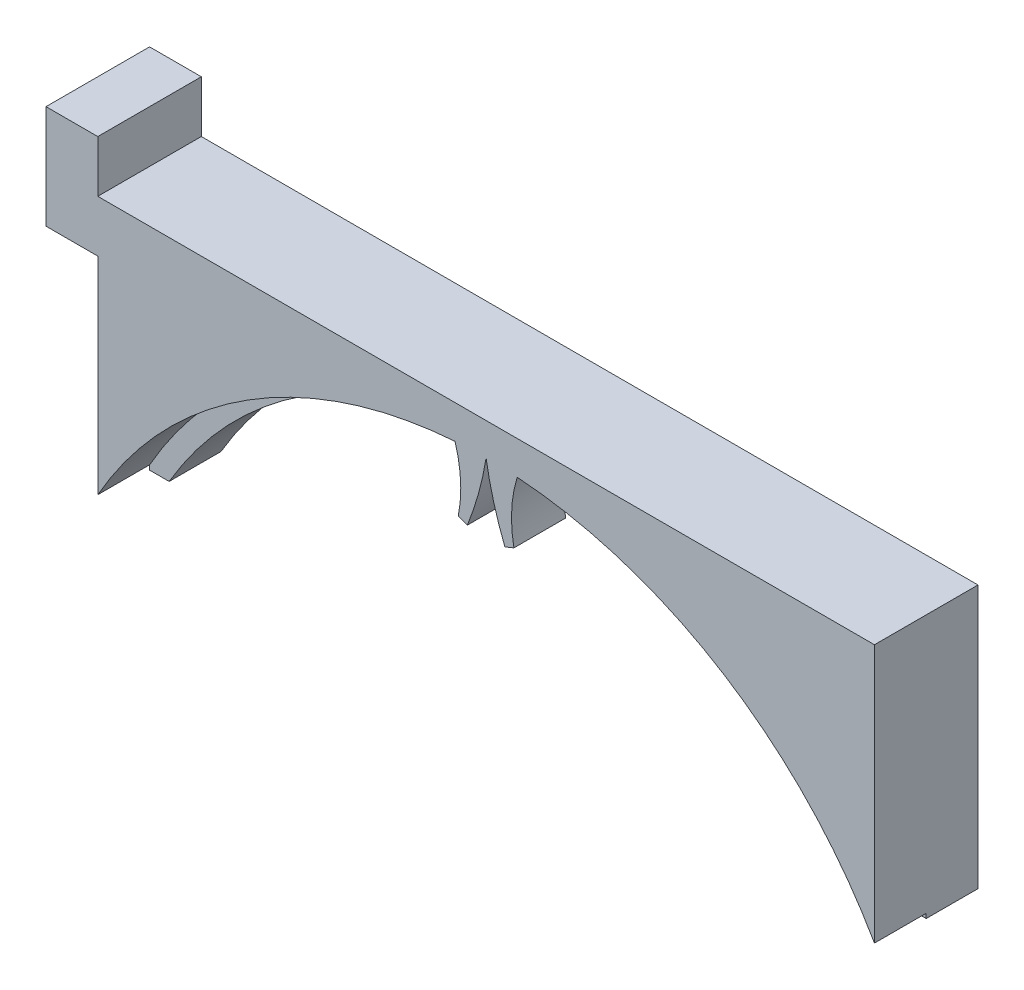
ISO-10303-21;
HEADER;
FILE_DESCRIPTION(('STEP AP214'),'2;1');
FILE_NAME('part.step','',(''),(''),'','','');
FILE_SCHEMA(('AUTOMOTIVE_DESIGN { 1 0 10303 214 1 1 1 1 }'));
ENDSEC;
DATA;
#1=APPLICATION_CONTEXT('core data for automotive mechanical design processes');
#2=APPLICATION_PROTOCOL_DEFINITION('international standard','automotive_design',2000,#1);
#3=PRODUCT_CONTEXT('',#1,'mechanical');
#4=PRODUCT('Part','Part','',(#3));
#5=PRODUCT_RELATED_PRODUCT_CATEGORY('part','',(#4));
#6=PRODUCT_DEFINITION_FORMATION('','',#4);
#7=PRODUCT_DEFINITION_CONTEXT('part definition',#1,'design');
#8=PRODUCT_DEFINITION('design','',#6,#7);
#9=PRODUCT_DEFINITION_SHAPE('','',#8);
#10=(LENGTH_UNIT() NAMED_UNIT(*) SI_UNIT(.MILLI.,.METRE.));
#11=(NAMED_UNIT(*) PLANE_ANGLE_UNIT() SI_UNIT($,.RADIAN.));
#12=(NAMED_UNIT(*) SI_UNIT($,.STERADIAN.) SOLID_ANGLE_UNIT());
#13=UNCERTAINTY_MEASURE_WITH_UNIT(LENGTH_MEASURE(1.E-05),#10,'distance_accuracy_value','');
#14=(GEOMETRIC_REPRESENTATION_CONTEXT(3) GLOBAL_UNCERTAINTY_ASSIGNED_CONTEXT((#13)) GLOBAL_UNIT_ASSIGNED_CONTEXT((#10,
#11,#12)) REPRESENTATION_CONTEXT('',''));
#15=CARTESIAN_POINT('',(0.,0.,0.));
#16=DIRECTION('',(0.,0.,1.));
#17=DIRECTION('',(1.,0.,0.));
#18=AXIS2_PLACEMENT_3D('',#15,#16,#17);
#19=CARTESIAN_POINT('',(-75.,0.,10.));
#20=DIRECTION('',(1.,0.,0.));
#21=DIRECTION('',(0.,0.,-1.));
#22=AXIS2_PLACEMENT_3D('',#19,#20,#21);
#23=PLANE('',#22);
#24=DIRECTION('',(0.,0.,1.));
#25=VECTOR('',#24,1.);
#26=CARTESIAN_POINT('',(-75.,-10.,0.));
#27=LINE('',#26,#25);
#28=CARTESIAN_POINT('',(-75.,-10.,0.));
#29=VERTEX_POINT('',#28);
#30=CARTESIAN_POINT('',(-75.,-10.,20.));
#31=VERTEX_POINT('',#30);
#32=EDGE_CURVE('E50',#29,#31,#27,.T.);
#33=ORIENTED_EDGE('',*,*,#32,.F.);
#34=DIRECTION('',(0.,-1.,0.));
#35=VECTOR('',#34,1.);
#36=CARTESIAN_POINT('',(-75.,0.,0.));
#37=LINE('',#36,#35);
#38=CARTESIAN_POINT('',(-75.,-50.8,0.));
#39=VERTEX_POINT('',#38);
#40=EDGE_CURVE('E197',#29,#39,#37,.T.);
#41=ORIENTED_EDGE('',*,*,#40,.T.);
#42=DIRECTION('',(0.,0.,-1.));
#43=VECTOR('',#42,1.);
#44=CARTESIAN_POINT('',(-75.,-50.8,10.));
#45=LINE('',#44,#43);
#46=CARTESIAN_POINT('',(-75.,-50.8,10.));
#47=VERTEX_POINT('',#46);
#48=EDGE_CURVE('E36',#47,#39,#45,.T.);
#49=ORIENTED_EDGE('',*,*,#48,.F.);
#50=DIRECTION('',(0.,-1.,0.));
#51=VECTOR('',#50,1.);
#52=CARTESIAN_POINT('',(-75.,0.,10.));
#53=LINE('',#52,#51);
#54=CARTESIAN_POINT('',(-75.,-49.9130466946871,10.));
#55=VERTEX_POINT('',#54);
#56=EDGE_CURVE('E291',#55,#47,#53,.T.);
#57=ORIENTED_EDGE('',*,*,#56,.F.);
#58=DIRECTION('',(0.,0.,-1.));
#59=VECTOR('',#58,1.);
#60=CARTESIAN_POINT('',(-75.,-49.9130466946871,20.));
#61=LINE('',#60,#59);
#62=CARTESIAN_POINT('',(-75.,-49.9130466946871,20.));
#63=VERTEX_POINT('',#62);
#64=EDGE_CURVE('E276',#63,#55,#61,.T.);
#65=ORIENTED_EDGE('',*,*,#64,.F.);
#66=DIRECTION('',(0.,-1.,0.));
#67=VECTOR('',#66,1.);
#68=CARTESIAN_POINT('',(-75.,0.,20.));
#69=LINE('',#68,#67);
#70=EDGE_CURVE('E235',#31,#63,#69,.T.);
#71=ORIENTED_EDGE('',*,*,#70,.F.);
#72=EDGE_LOOP('',(#33,#41,#49,#57,#65,#71));
#73=FACE_BOUND('',#72,.T.);
#74=ADVANCED_FACE('F33',(#73),#23,.F.);
#75=CARTESIAN_POINT('',(0.,-92.55,10.));
#76=DIRECTION('',(0.,0.,1.));
#77=DIRECTION('',(1.,0.,0.));
#78=AXIS2_PLACEMENT_3D('',#75,#76,#77);
#79=PLANE('',#78);
#80=CARTESIAN_POINT('',(61.4291765688217,3.78478174448975,10.));
#81=DIRECTION('',(0.,0.,1.));
#82=DIRECTION('',(1.,0.,0.));
#83=AXIS2_PLACEMENT_3D('',#80,#81,#82);
#84=CIRCLE('',#83,62.2478695870906);
#85=CARTESIAN_POINT('',(0.,-6.27769976893262,10.));
#86=VERTEX_POINT('',#85);
#87=CARTESIAN_POINT('',(0.727540184914201,-10.0032060872178,10.));
#88=VERTEX_POINT('',#87);
#89=EDGE_CURVE('E58',#86,#88,#84,.T.);
#90=ORIENTED_EDGE('',*,*,#89,.F.);
#91=CARTESIAN_POINT('',(-61.4291765688217,3.78478174448973,10.));
#92=DIRECTION('',(0.,0.,1.));
#93=DIRECTION('',(-1.,0.,0.));
#94=AXIS2_PLACEMENT_3D('',#91,#92,#93);
#95=CIRCLE('',#94,62.2478695870906);
#96=CARTESIAN_POINT('',(-0.727540184914173,-10.0032060872178,10.));
#97=VERTEX_POINT('',#96);
#98=EDGE_CURVE('E11',#97,#86,#95,.T.);
#99=ORIENTED_EDGE('',*,*,#98,.F.);
#100=CARTESIAN_POINT('',(0.,-92.55,10.));
#101=DIRECTION('',(0.,0.,-1.));
#102=DIRECTION('',(1.,0.,0.));
#103=AXIS2_PLACEMENT_3D('',#100,#101,#102);
#104=CIRCLE('',#103,82.55);
#105=EDGE_CURVE('E361',#97,#88,#104,.T.);
#106=ORIENTED_EDGE('',*,*,#105,.T.);
#107=EDGE_LOOP('',(#90,#99,#106));
#108=FACE_BOUND('',#107,.T.);
#109=ADVANCED_FACE('F419',(#108),#79,.T.);
#110=CARTESIAN_POINT('',(-29.6489004395039,-13.8015963330488,10.));
#111=DIRECTION('',(0.,0.,-1.));
#112=DIRECTION('',(-1.,0.,0.));
#113=AXIS2_PLACEMENT_3D('',#110,#111,#112);
#114=CIRCLE('',#113,24.7543884107778);
#115=CARTESIAN_POINT('',(-6.,-6.48659437856629,10.));
#116=VERTEX_POINT('',#115);
#117=CARTESIAN_POINT('',(-5.16358745807501,-10.1616521311247,10.));
#118=VERTEX_POINT('',#117);
#119=EDGE_CURVE('E259',#116,#118,#114,.T.);
#120=ORIENTED_EDGE('',*,*,#119,.F.);
#121=CARTESIAN_POINT('',(0.,-92.55,10.));
#122=DIRECTION('',(0.,0.,-1.));
#123=DIRECTION('',(1.,0.,0.));
#124=AXIS2_PLACEMENT_3D('',#121,#122,#123);
#125=CIRCLE('',#124,86.2723002310674);
#126=EDGE_CURVE('E255',#55,#116,#125,.T.);
#127=ORIENTED_EDGE('',*,*,#126,.F.);
#128=ORIENTED_EDGE('',*,*,#56,.T.);
#129=DIRECTION('',(1.,0.,0.));
#130=VECTOR('',#129,1.);
#131=CARTESIAN_POINT('',(-75.,-50.8,10.));
#132=LINE('',#131,#130);
#133=CARTESIAN_POINT('',(-71.2140435588375,-50.8,10.));
#134=VERTEX_POINT('',#133);
#135=EDGE_CURVE('E293',#47,#134,#132,.T.);
#136=ORIENTED_EDGE('',*,*,#135,.T.);
#137=EDGE_CURVE('E297',#134,#118,#104,.T.);
#138=ORIENTED_EDGE('',*,*,#137,.T.);
#139=EDGE_LOOP('',(#120,#127,#128,#136,#138));
#140=FACE_BOUND('',#139,.T.);
#141=ADVANCED_FACE('F423',(#140),#79,.T.);
#142=CARTESIAN_POINT('',(0.,-92.55,10.));
#143=DIRECTION('',(0.,0.,-1.));
#144=DIRECTION('',(1.,0.,0.));
#145=AXIS2_PLACEMENT_3D('',#142,#143,#144);
#146=CIRCLE('',#145,86.2723002310674);
#147=CARTESIAN_POINT('',(6.00000000000001,-6.48659437856627,10.));
#148=VERTEX_POINT('',#147);
#149=CARTESIAN_POINT('',(75.,-49.9130466946871,10.));
#150=VERTEX_POINT('',#149);
#151=EDGE_CURVE('E252',#148,#150,#146,.T.);
#152=ORIENTED_EDGE('',*,*,#151,.F.);
#153=CARTESIAN_POINT('',(29.6489004395039,-13.8015963330488,10.));
#154=DIRECTION('',(0.,0.,-1.));
#155=DIRECTION('',(-1.,0.,0.));
#156=AXIS2_PLACEMENT_3D('',#153,#154,#155);
#157=CIRCLE('',#156,24.7543884107778);
#158=CARTESIAN_POINT('',(5.16358745807501,-10.1616521311247,10.));
#159=VERTEX_POINT('',#158);
#160=EDGE_CURVE('E41',#159,#148,#157,.T.);
#161=ORIENTED_EDGE('',*,*,#160,.F.);
#162=CARTESIAN_POINT('',(71.2140435588375,-50.8,10.));
#163=VERTEX_POINT('',#162);
#164=EDGE_CURVE('E296',#159,#163,#104,.T.);
#165=ORIENTED_EDGE('',*,*,#164,.T.);
#166=DIRECTION('',(1.,0.,0.));
#167=VECTOR('',#166,1.);
#168=CARTESIAN_POINT('',(71.2140435588375,-50.8,10.));
#169=LINE('',#168,#167);
#170=CARTESIAN_POINT('',(75.,-50.8,10.));
#171=VERTEX_POINT('',#170);
#172=EDGE_CURVE('E300',#163,#171,#169,.T.);
#173=ORIENTED_EDGE('',*,*,#172,.T.);
#174=DIRECTION('',(0.,1.,0.));
#175=VECTOR('',#174,1.);
#176=CARTESIAN_POINT('',(75.,0.,10.));
#177=LINE('',#176,#175);
#178=EDGE_CURVE('E303',#171,#150,#177,.T.);
#179=ORIENTED_EDGE('',*,*,#178,.T.);
#180=EDGE_LOOP('',(#152,#161,#165,#173,#179));
#181=FACE_BOUND('',#180,.T.);
#182=ADVANCED_FACE('F363',(#181),#79,.T.);
#183=CARTESIAN_POINT('',(-75.,-50.8,10.));
#184=DIRECTION('',(0.,1.,0.));
#185=DIRECTION('',(0.,0.,1.));
#186=AXIS2_PLACEMENT_3D('',#183,#184,#185);
#187=PLANE('',#186);
#188=DIRECTION('',(1.,0.,0.));
#189=VECTOR('',#188,1.);
#190=CARTESIAN_POINT('',(-75.,-50.8,0.));
#191=LINE('',#190,#189);
#192=CARTESIAN_POINT('',(-71.2140435588375,-50.8,0.));
#193=VERTEX_POINT('',#192);
#194=EDGE_CURVE('E307',#39,#193,#191,.T.);
#195=ORIENTED_EDGE('',*,*,#194,.T.);
#196=DIRECTION('',(0.,0.,-1.));
#197=VECTOR('',#196,1.);
#198=CARTESIAN_POINT('',(-71.2140435588375,-50.8,10.));
#199=LINE('',#198,#197);
#200=EDGE_CURVE('E326',#134,#193,#199,.T.);
#201=ORIENTED_EDGE('',*,*,#200,.F.);
#202=ORIENTED_EDGE('',*,*,#135,.F.);
#203=ORIENTED_EDGE('',*,*,#48,.T.);
#204=EDGE_LOOP('',(#195,#201,#202,#203));
#205=FACE_BOUND('',#204,.T.);
#206=ADVANCED_FACE('F431',(#205),#187,.F.);
#207=CARTESIAN_POINT('',(0.,-92.55,10.));
#208=DIRECTION('',(0.,0.,-1.));
#209=DIRECTION('',(-1.,0.,0.));
#210=AXIS2_PLACEMENT_3D('',#207,#208,#209);
#211=CYLINDRICAL_SURFACE('',#210,82.55);
#212=CARTESIAN_POINT('',(0.,-92.55,0.));
#213=DIRECTION('',(0.,0.,-1.));
#214=DIRECTION('',(1.,0.,0.));
#215=AXIS2_PLACEMENT_3D('',#212,#213,#214);
#216=CIRCLE('',#215,82.55);
#217=CARTESIAN_POINT('',(71.2140435588375,-50.8,0.));
#218=VERTEX_POINT('',#217);
#219=EDGE_CURVE('E309',#193,#218,#216,.T.);
#220=ORIENTED_EDGE('',*,*,#219,.T.);
#221=DIRECTION('',(0.,0.,-1.));
#222=VECTOR('',#221,1.);
#223=CARTESIAN_POINT('',(71.2140435588375,-50.8,10.));
#224=LINE('',#223,#222);
#225=EDGE_CURVE('E324',#163,#218,#224,.T.);
#226=ORIENTED_EDGE('',*,*,#225,.F.);
#227=ORIENTED_EDGE('',*,*,#164,.F.);
#228=EDGE_CURVE('E359',#88,#159,#104,.T.);
#229=ORIENTED_EDGE('',*,*,#228,.F.);
#230=ORIENTED_EDGE('',*,*,#105,.F.);
#231=EDGE_CURVE('E301',#118,#97,#104,.T.);
#232=ORIENTED_EDGE('',*,*,#231,.F.);
#233=ORIENTED_EDGE('',*,*,#137,.F.);
#234=ORIENTED_EDGE('',*,*,#200,.T.);
#235=EDGE_LOOP('',(#220,#226,#227,#229,#230,#232,#233,#234));
#236=FACE_BOUND('',#235,.T.);
#237=ADVANCED_FACE('F366',(#236),#211,.F.);
#238=CARTESIAN_POINT('',(71.2140435588375,-50.8,10.));
#239=DIRECTION('',(0.,1.,0.));
#240=DIRECTION('',(0.,0.,1.));
#241=AXIS2_PLACEMENT_3D('',#238,#239,#240);
#242=PLANE('',#241);
#243=DIRECTION('',(1.,0.,0.));
#244=VECTOR('',#243,1.);
#245=CARTESIAN_POINT('',(71.2140435588375,-50.8,0.));
#246=LINE('',#245,#244);
#247=CARTESIAN_POINT('',(75.,-50.8,0.));
#248=VERTEX_POINT('',#247);
#249=EDGE_CURVE('E311',#218,#248,#246,.T.);
#250=ORIENTED_EDGE('',*,*,#249,.T.);
#251=DIRECTION('',(0.,0.,-1.));
#252=VECTOR('',#251,1.);
#253=CARTESIAN_POINT('',(75.,-50.8,10.));
#254=LINE('',#253,#252);
#255=EDGE_CURVE('E321',#171,#248,#254,.T.);
#256=ORIENTED_EDGE('',*,*,#255,.F.);
#257=ORIENTED_EDGE('',*,*,#172,.F.);
#258=ORIENTED_EDGE('',*,*,#225,.T.);
#259=EDGE_LOOP('',(#250,#256,#257,#258));
#260=FACE_BOUND('',#259,.T.);
#261=ADVANCED_FACE('F369',(#260),#242,.F.);
#262=CARTESIAN_POINT('',(75.,0.,10.));
#263=DIRECTION('',(-1.,0.,0.));
#264=DIRECTION('',(0.,0.,1.));
#265=AXIS2_PLACEMENT_3D('',#262,#263,#264);
#266=PLANE('',#265);
#267=DIRECTION('',(0.,1.,0.));
#268=VECTOR('',#267,1.);
#269=CARTESIAN_POINT('',(75.,0.,0.));
#270=LINE('',#269,#268);
#271=CARTESIAN_POINT('',(75.,0.,0.));
#272=VERTEX_POINT('',#271);
#273=EDGE_CURVE('E313',#248,#272,#270,.T.);
#274=ORIENTED_EDGE('',*,*,#273,.T.);
#275=DIRECTION('',(0.,0.,-1.));
#276=VECTOR('',#275,1.);
#277=CARTESIAN_POINT('',(75.,0.,10.));
#278=LINE('',#277,#276);
#279=CARTESIAN_POINT('',(75.,0.,20.));
#280=VERTEX_POINT('',#279);
#281=EDGE_CURVE('E318',#280,#272,#278,.T.);
#282=ORIENTED_EDGE('',*,*,#281,.F.);
#283=DIRECTION('',(0.,1.,0.));
#284=VECTOR('',#283,1.);
#285=CARTESIAN_POINT('',(75.,0.,20.));
#286=LINE('',#285,#284);
#287=CARTESIAN_POINT('',(75.,-49.9130466946872,20.));
#288=VERTEX_POINT('',#287);
#289=EDGE_CURVE('E229',#288,#280,#286,.T.);
#290=ORIENTED_EDGE('',*,*,#289,.F.);
#291=DIRECTION('',(0.,0.,-1.));
#292=VECTOR('',#291,1.);
#293=CARTESIAN_POINT('',(75.,-49.9130466946872,20.));
#294=LINE('',#293,#292);
#295=EDGE_CURVE('E279',#288,#150,#294,.T.);
#296=ORIENTED_EDGE('',*,*,#295,.T.);
#297=ORIENTED_EDGE('',*,*,#178,.F.);
#298=ORIENTED_EDGE('',*,*,#255,.T.);
#299=EDGE_LOOP('',(#274,#282,#290,#296,#297,#298));
#300=FACE_BOUND('',#299,.T.);
#301=ADVANCED_FACE('F373',(#300),#266,.F.);
#302=CARTESIAN_POINT('',(-75.,0.,10.));
#303=DIRECTION('',(0.,-1.,0.));
#304=DIRECTION('',(0.,0.,-1.));
#305=AXIS2_PLACEMENT_3D('',#302,#303,#304);
#306=PLANE('',#305);
#307=DIRECTION('',(-1.,0.,0.));
#308=VECTOR('',#307,1.);
#309=CARTESIAN_POINT('',(-75.,0.,0.));
#310=LINE('',#309,#308);
#311=CARTESIAN_POINT('',(-75.,0.,0.));
#312=VERTEX_POINT('',#311);
#313=EDGE_CURVE('E294',#272,#312,#310,.T.);
#314=ORIENTED_EDGE('',*,*,#313,.T.);
#315=DIRECTION('',(0.,0.,-1.));
#316=VECTOR('',#315,1.);
#317=CARTESIAN_POINT('',(-75.,0.,10.));
#318=LINE('',#317,#316);
#319=CARTESIAN_POINT('',(-75.,0.,20.));
#320=VERTEX_POINT('',#319);
#321=EDGE_CURVE('E305',#320,#312,#318,.T.);
#322=ORIENTED_EDGE('',*,*,#321,.F.);
#323=DIRECTION('',(-1.,0.,0.));
#324=VECTOR('',#323,1.);
#325=CARTESIAN_POINT('',(75.,0.,20.));
#326=LINE('',#325,#324);
#327=EDGE_CURVE('E232',#280,#320,#326,.T.);
#328=ORIENTED_EDGE('',*,*,#327,.F.);
#329=ORIENTED_EDGE('',*,*,#281,.T.);
#330=EDGE_LOOP('',(#314,#322,#328,#329));
#331=FACE_BOUND('',#330,.T.);
#332=ADVANCED_FACE('F376',(#331),#306,.F.);
#333=CARTESIAN_POINT('',(0.,-92.55,0.));
#334=DIRECTION('',(0.,0.,1.));
#335=DIRECTION('',(1.,0.,0.));
#336=AXIS2_PLACEMENT_3D('',#333,#334,#335);
#337=PLANE('',#336);
#338=ORIENTED_EDGE('',*,*,#40,.F.);
#339=DIRECTION('',(1.,0.,0.));
#340=VECTOR('',#339,1.);
#341=CARTESIAN_POINT('',(-85.,-10.,0.));
#342=LINE('',#341,#340);
#343=CARTESIAN_POINT('',(-85.,-10.,0.));
#344=VERTEX_POINT('',#343);
#345=EDGE_CURVE('E181',#344,#29,#342,.T.);
#346=ORIENTED_EDGE('',*,*,#345,.F.);
#347=DIRECTION('',(0.,-1.,0.));
#348=VECTOR('',#347,1.);
#349=CARTESIAN_POINT('',(-85.,10.,0.));
#350=LINE('',#349,#348);
#351=CARTESIAN_POINT('',(-85.,10.,0.));
#352=VERTEX_POINT('',#351);
#353=EDGE_CURVE('E194',#352,#344,#350,.T.);
#354=ORIENTED_EDGE('',*,*,#353,.F.);
#355=DIRECTION('',(-1.,0.,0.));
#356=VECTOR('',#355,1.);
#357=CARTESIAN_POINT('',(-85.,10.,0.));
#358=LINE('',#357,#356);
#359=CARTESIAN_POINT('',(-75.,10.,0.));
#360=VERTEX_POINT('',#359);
#361=EDGE_CURVE('E188',#360,#352,#358,.T.);
#362=ORIENTED_EDGE('',*,*,#361,.F.);
#363=DIRECTION('',(0.,1.,0.));
#364=VECTOR('',#363,1.);
#365=CARTESIAN_POINT('',(-75.,10.,0.));
#366=LINE('',#365,#364);
#367=EDGE_CURVE('E198',#312,#360,#366,.T.);
#368=ORIENTED_EDGE('',*,*,#367,.F.);
#369=ORIENTED_EDGE('',*,*,#313,.F.);
#370=ORIENTED_EDGE('',*,*,#273,.F.);
#371=ORIENTED_EDGE('',*,*,#249,.F.);
#372=ORIENTED_EDGE('',*,*,#219,.F.);
#373=ORIENTED_EDGE('',*,*,#194,.F.);
#374=EDGE_LOOP('',(#338,#346,#354,#362,#368,#369,#370,#371,#372,#373));
#375=FACE_BOUND('',#374,.T.);
#376=ADVANCED_FACE('F192',(#375),#337,.F.);
#377=CARTESIAN_POINT('',(61.4291765688217,3.78478174448975,10.));
#378=DIRECTION('',(0.,0.,1.));
#379=DIRECTION('',(1.,0.,0.));
#380=AXIS2_PLACEMENT_3D('',#377,#378,#379);
#381=PLANE('',#380);
#382=CARTESIAN_POINT('',(-5.3685730558256,-18.6229496423441,10.));
#383=VERTEX_POINT('',#382);
#384=EDGE_CURVE('E258',#118,#383,#114,.T.);
#385=ORIENTED_EDGE('',*,*,#384,.F.);
#386=ORIENTED_EDGE('',*,*,#231,.T.);
#387=CARTESIAN_POINT('',(-3.62761255381291,-19.3188211249824,10.));
#388=VERTEX_POINT('',#387);
#389=EDGE_CURVE('E43',#388,#97,#95,.T.);
#390=ORIENTED_EDGE('',*,*,#389,.F.);
#391=DIRECTION('',(0.928570959912756,-0.371154916991144,0.));
#392=VECTOR('',#391,1.);
#393=CARTESIAN_POINT('',(-3.62761255381292,-19.3188211249824,10.));
#394=LINE('',#393,#392);
#395=EDGE_CURVE('E262',#383,#388,#394,.T.);
#396=ORIENTED_EDGE('',*,*,#395,.F.);
#397=EDGE_LOOP('',(#385,#386,#390,#396));
#398=FACE_BOUND('',#397,.T.);
#399=ADVANCED_FACE('F446',(#398),#381,.F.);
#400=CARTESIAN_POINT('',(3.62761255381293,-19.3188211249824,10.));
#401=VERTEX_POINT('',#400);
#402=EDGE_CURVE('E215',#88,#401,#84,.T.);
#403=ORIENTED_EDGE('',*,*,#402,.F.);
#404=ORIENTED_EDGE('',*,*,#228,.T.);
#405=CARTESIAN_POINT('',(5.36857305582561,-18.6229496423441,10.));
#406=VERTEX_POINT('',#405);
#407=EDGE_CURVE('E249',#406,#159,#157,.T.);
#408=ORIENTED_EDGE('',*,*,#407,.F.);
#409=DIRECTION('',(0.928570959912756,0.371154916991144,0.));
#410=VECTOR('',#409,1.);
#411=CARTESIAN_POINT('',(3.62761255381293,-19.3188211249824,10.));
#412=LINE('',#411,#410);
#413=EDGE_CURVE('E247',#401,#406,#412,.T.);
#414=ORIENTED_EDGE('',*,*,#413,.F.);
#415=EDGE_LOOP('',(#403,#404,#408,#414));
#416=FACE_BOUND('',#415,.T.);
#417=ADVANCED_FACE('F358',(#416),#381,.F.);
#418=CARTESIAN_POINT('',(61.4291765688217,3.78478174448975,20.));
#419=DIRECTION('',(0.,0.,-1.));
#420=DIRECTION('',(-1.,0.,0.));
#421=AXIS2_PLACEMENT_3D('',#418,#419,#420);
#422=CYLINDRICAL_SURFACE('',#421,62.2478695870906);
#423=ORIENTED_EDGE('',*,*,#89,.T.);
#424=ORIENTED_EDGE('',*,*,#402,.T.);
#425=DIRECTION('',(0.,0.,-1.));
#426=VECTOR('',#425,1.);
#427=CARTESIAN_POINT('',(3.62761255381293,-19.3188211249824,20.));
#428=LINE('',#427,#426);
#429=CARTESIAN_POINT('',(3.62761255381293,-19.3188211249824,20.));
#430=VERTEX_POINT('',#429);
#431=EDGE_CURVE('E288',#430,#401,#428,.T.);
#432=ORIENTED_EDGE('',*,*,#431,.F.);
#433=CARTESIAN_POINT('',(61.4291765688217,3.78478174448975,20.));
#434=DIRECTION('',(0.,0.,1.));
#435=DIRECTION('',(1.,0.,0.));
#436=AXIS2_PLACEMENT_3D('',#433,#434,#435);
#437=CIRCLE('',#436,62.2478695870906);
#438=CARTESIAN_POINT('',(0.,-6.27769976893262,20.));
#439=VERTEX_POINT('',#438);
#440=EDGE_CURVE('E220',#439,#430,#437,.T.);
#441=ORIENTED_EDGE('',*,*,#440,.F.);
#442=DIRECTION('',(0.,0.,-1.));
#443=VECTOR('',#442,1.);
#444=CARTESIAN_POINT('',(0.,-6.27769976893262,20.));
#445=LINE('',#444,#443);
#446=EDGE_CURVE('E245',#439,#86,#445,.T.);
#447=ORIENTED_EDGE('',*,*,#446,.T.);
#448=EDGE_LOOP('',(#423,#424,#432,#441,#447));
#449=FACE_BOUND('',#448,.T.);
#450=ADVANCED_FACE('F408',(#449),#422,.T.);
#451=CARTESIAN_POINT('',(3.62761255381293,-19.3188211249824,20.));
#452=DIRECTION('',(-0.371154916991144,0.928570959912756,0.));
#453=DIRECTION('',(-0.928570959912756,-0.371154916991144,0.));
#454=AXIS2_PLACEMENT_3D('',#451,#452,#453);
#455=PLANE('',#454);
#456=ORIENTED_EDGE('',*,*,#413,.T.);
#457=DIRECTION('',(0.,0.,-1.));
#458=VECTOR('',#457,1.);
#459=CARTESIAN_POINT('',(5.36857305582561,-18.6229496423441,20.));
#460=LINE('',#459,#458);
#461=CARTESIAN_POINT('',(5.36857305582561,-18.6229496423441,20.));
#462=VERTEX_POINT('',#461);
#463=EDGE_CURVE('E285',#462,#406,#460,.T.);
#464=ORIENTED_EDGE('',*,*,#463,.F.);
#465=DIRECTION('',(0.928570959912756,0.371154916991144,0.));
#466=VECTOR('',#465,1.);
#467=CARTESIAN_POINT('',(3.62761255381293,-19.3188211249824,20.));
#468=LINE('',#467,#466);
#469=EDGE_CURVE('E223',#430,#462,#468,.T.);
#470=ORIENTED_EDGE('',*,*,#469,.F.);
#471=ORIENTED_EDGE('',*,*,#431,.T.);
#472=EDGE_LOOP('',(#456,#464,#470,#471));
#473=FACE_BOUND('',#472,.T.);
#474=ADVANCED_FACE('F409',(#473),#455,.F.);
#475=CARTESIAN_POINT('',(29.6489004395039,-13.8015963330488,20.));
#476=DIRECTION('',(0.,0.,-1.));
#477=DIRECTION('',(-1.,0.,0.));
#478=AXIS2_PLACEMENT_3D('',#475,#476,#477);
#479=CYLINDRICAL_SURFACE('',#478,24.7543884107778);
#480=ORIENTED_EDGE('',*,*,#407,.T.);
#481=ORIENTED_EDGE('',*,*,#160,.T.);
#482=DIRECTION('',(0.,0.,-1.));
#483=VECTOR('',#482,1.);
#484=CARTESIAN_POINT('',(6.00000000000001,-6.48659437856627,20.));
#485=LINE('',#484,#483);
#486=CARTESIAN_POINT('',(6.00000000000001,-6.48659437856627,20.));
#487=VERTEX_POINT('',#486);
#488=EDGE_CURVE('E282',#487,#148,#485,.T.);
#489=ORIENTED_EDGE('',*,*,#488,.F.);
#490=CARTESIAN_POINT('',(29.6489004395039,-13.8015963330488,20.));
#491=DIRECTION('',(0.,0.,-1.));
#492=DIRECTION('',(-1.,0.,0.));
#493=AXIS2_PLACEMENT_3D('',#490,#491,#492);
#494=CIRCLE('',#493,24.7543884107778);
#495=EDGE_CURVE('E225',#462,#487,#494,.T.);
#496=ORIENTED_EDGE('',*,*,#495,.F.);
#497=ORIENTED_EDGE('',*,*,#463,.T.);
#498=EDGE_LOOP('',(#480,#481,#489,#496,#497));
#499=FACE_BOUND('',#498,.T.);
#500=ADVANCED_FACE('F339',(#499),#479,.F.);
#501=CARTESIAN_POINT('',(0.,-92.55,20.));
#502=DIRECTION('',(0.,0.,-1.));
#503=DIRECTION('',(-1.,0.,0.));
#504=AXIS2_PLACEMENT_3D('',#501,#502,#503);
#505=CYLINDRICAL_SURFACE('',#504,86.2723002310674);
#506=ORIENTED_EDGE('',*,*,#151,.T.);
#507=ORIENTED_EDGE('',*,*,#295,.F.);
#508=CARTESIAN_POINT('',(0.,-92.55,20.));
#509=DIRECTION('',(0.,0.,-1.));
#510=DIRECTION('',(1.,0.,0.));
#511=AXIS2_PLACEMENT_3D('',#508,#509,#510);
#512=CIRCLE('',#511,86.2723002310674);
#513=EDGE_CURVE('E227',#487,#288,#512,.T.);
#514=ORIENTED_EDGE('',*,*,#513,.F.);
#515=ORIENTED_EDGE('',*,*,#488,.T.);
#516=EDGE_LOOP('',(#506,#507,#514,#515));
#517=FACE_BOUND('',#516,.T.);
#518=ADVANCED_FACE('F346',(#517),#505,.F.);
#519=CARTESIAN_POINT('',(0.,-92.55,20.));
#520=DIRECTION('',(0.,0.,-1.));
#521=DIRECTION('',(-1.,0.,0.));
#522=AXIS2_PLACEMENT_3D('',#519,#520,#521);
#523=CYLINDRICAL_SURFACE('',#522,86.2723002310674);
#524=ORIENTED_EDGE('',*,*,#126,.T.);
#525=DIRECTION('',(0.,0.,-1.));
#526=VECTOR('',#525,1.);
#527=CARTESIAN_POINT('',(-6.,-6.48659437856629,20.));
#528=LINE('',#527,#526);
#529=CARTESIAN_POINT('',(-6.,-6.48659437856629,20.));
#530=VERTEX_POINT('',#529);
#531=EDGE_CURVE('E273',#530,#116,#528,.T.);
#532=ORIENTED_EDGE('',*,*,#531,.F.);
#533=CARTESIAN_POINT('',(0.,-92.55,20.));
#534=DIRECTION('',(0.,0.,-1.));
#535=DIRECTION('',(1.,0.,0.));
#536=AXIS2_PLACEMENT_3D('',#533,#534,#535);
#537=CIRCLE('',#536,86.2723002310674);
#538=EDGE_CURVE('E237',#63,#530,#537,.T.);
#539=ORIENTED_EDGE('',*,*,#538,.F.);
#540=ORIENTED_EDGE('',*,*,#64,.T.);
#541=EDGE_LOOP('',(#524,#532,#539,#540));
#542=FACE_BOUND('',#541,.T.);
#543=ADVANCED_FACE('F390',(#542),#523,.F.);
#544=CARTESIAN_POINT('',(-29.6489004395039,-13.8015963330488,20.));
#545=DIRECTION('',(0.,0.,-1.));
#546=DIRECTION('',(-1.,0.,0.));
#547=AXIS2_PLACEMENT_3D('',#544,#545,#546);
#548=CYLINDRICAL_SURFACE('',#547,24.7543884107778);
#549=ORIENTED_EDGE('',*,*,#119,.T.);
#550=ORIENTED_EDGE('',*,*,#384,.T.);
#551=DIRECTION('',(0.,0.,-1.));
#552=VECTOR('',#551,1.);
#553=CARTESIAN_POINT('',(-5.3685730558256,-18.6229496423441,20.));
#554=LINE('',#553,#552);
#555=CARTESIAN_POINT('',(-5.3685730558256,-18.6229496423441,20.));
#556=VERTEX_POINT('',#555);
#557=EDGE_CURVE('E270',#556,#383,#554,.T.);
#558=ORIENTED_EDGE('',*,*,#557,.F.);
#559=CARTESIAN_POINT('',(-29.6489004395039,-13.8015963330488,20.));
#560=DIRECTION('',(0.,0.,-1.));
#561=DIRECTION('',(-1.,0.,0.));
#562=AXIS2_PLACEMENT_3D('',#559,#560,#561);
#563=CIRCLE('',#562,24.7543884107778);
#564=EDGE_CURVE('E239',#530,#556,#563,.T.);
#565=ORIENTED_EDGE('',*,*,#564,.F.);
#566=ORIENTED_EDGE('',*,*,#531,.T.);
#567=EDGE_LOOP('',(#549,#550,#558,#565,#566));
#568=FACE_BOUND('',#567,.T.);
#569=ADVANCED_FACE('F394',(#568),#548,.F.);
#570=CARTESIAN_POINT('',(-3.62761255381292,-19.3188211249824,20.));
#571=DIRECTION('',(0.371154916991144,0.928570959912756,0.));
#572=DIRECTION('',(-0.928570959912756,0.371154916991144,0.));
#573=AXIS2_PLACEMENT_3D('',#570,#571,#572);
#574=PLANE('',#573);
#575=ORIENTED_EDGE('',*,*,#395,.T.);
#576=DIRECTION('',(0.,0.,-1.));
#577=VECTOR('',#576,1.);
#578=CARTESIAN_POINT('',(-3.62761255381291,-19.3188211249824,20.));
#579=LINE('',#578,#577);
#580=CARTESIAN_POINT('',(-3.62761255381291,-19.3188211249824,20.));
#581=VERTEX_POINT('',#580);
#582=EDGE_CURVE('E267',#581,#388,#579,.T.);
#583=ORIENTED_EDGE('',*,*,#582,.F.);
#584=DIRECTION('',(0.928570959912756,-0.371154916991144,0.));
#585=VECTOR('',#584,1.);
#586=CARTESIAN_POINT('',(-3.62761255381292,-19.3188211249824,20.));
#587=LINE('',#586,#585);
#588=EDGE_CURVE('E241',#556,#581,#587,.T.);
#589=ORIENTED_EDGE('',*,*,#588,.F.);
#590=ORIENTED_EDGE('',*,*,#557,.T.);
#591=EDGE_LOOP('',(#575,#583,#589,#590));
#592=FACE_BOUND('',#591,.T.);
#593=ADVANCED_FACE('F400',(#592),#574,.F.);
#594=CARTESIAN_POINT('',(-61.4291765688217,3.78478174448973,20.));
#595=DIRECTION('',(0.,0.,-1.));
#596=DIRECTION('',(-1.,0.,0.));
#597=AXIS2_PLACEMENT_3D('',#594,#595,#596);
#598=CYLINDRICAL_SURFACE('',#597,62.2478695870906);
#599=ORIENTED_EDGE('',*,*,#389,.T.);
#600=ORIENTED_EDGE('',*,*,#98,.T.);
#601=ORIENTED_EDGE('',*,*,#446,.F.);
#602=CARTESIAN_POINT('',(-61.4291765688217,3.78478174448973,20.));
#603=DIRECTION('',(0.,0.,1.));
#604=DIRECTION('',(-1.,0.,0.));
#605=AXIS2_PLACEMENT_3D('',#602,#603,#604);
#606=CIRCLE('',#605,62.2478695870906);
#607=EDGE_CURVE('E243',#581,#439,#606,.T.);
#608=ORIENTED_EDGE('',*,*,#607,.F.);
#609=ORIENTED_EDGE('',*,*,#582,.T.);
#610=EDGE_LOOP('',(#599,#600,#601,#608,#609));
#611=FACE_BOUND('',#610,.T.);
#612=ADVANCED_FACE('F404',(#611),#598,.T.);
#613=CARTESIAN_POINT('',(61.4291765688217,3.78478174448975,20.));
#614=DIRECTION('',(0.,0.,1.));
#615=DIRECTION('',(1.,0.,0.));
#616=AXIS2_PLACEMENT_3D('',#613,#614,#615);
#617=PLANE('',#616);
#618=ORIENTED_EDGE('',*,*,#440,.T.);
#619=ORIENTED_EDGE('',*,*,#469,.T.);
#620=ORIENTED_EDGE('',*,*,#495,.T.);
#621=ORIENTED_EDGE('',*,*,#513,.T.);
#622=ORIENTED_EDGE('',*,*,#289,.T.);
#623=ORIENTED_EDGE('',*,*,#327,.T.);
#624=DIRECTION('',(0.,1.,0.));
#625=VECTOR('',#624,1.);
#626=CARTESIAN_POINT('',(-75.,10.,20.));
#627=LINE('',#626,#625);
#628=CARTESIAN_POINT('',(-75.,10.,20.));
#629=VERTEX_POINT('',#628);
#630=EDGE_CURVE('E205',#320,#629,#627,.T.);
#631=ORIENTED_EDGE('',*,*,#630,.T.);
#632=DIRECTION('',(-1.,0.,0.));
#633=VECTOR('',#632,1.);
#634=CARTESIAN_POINT('',(-85.,10.,20.));
#635=LINE('',#634,#633);
#636=CARTESIAN_POINT('',(-85.,10.,20.));
#637=VERTEX_POINT('',#636);
#638=EDGE_CURVE('E202',#629,#637,#635,.T.);
#639=ORIENTED_EDGE('',*,*,#638,.T.);
#640=DIRECTION('',(0.,-1.,0.));
#641=VECTOR('',#640,1.);
#642=CARTESIAN_POINT('',(-85.,10.,20.));
#643=LINE('',#642,#641);
#644=CARTESIAN_POINT('',(-85.,-10.,20.));
#645=VERTEX_POINT('',#644);
#646=EDGE_CURVE('E210',#637,#645,#643,.T.);
#647=ORIENTED_EDGE('',*,*,#646,.T.);
#648=DIRECTION('',(1.,0.,0.));
#649=VECTOR('',#648,1.);
#650=CARTESIAN_POINT('',(-85.,-10.,20.));
#651=LINE('',#650,#649);
#652=EDGE_CURVE('E183',#645,#31,#651,.T.);
#653=ORIENTED_EDGE('',*,*,#652,.T.);
#654=ORIENTED_EDGE('',*,*,#70,.T.);
#655=ORIENTED_EDGE('',*,*,#538,.T.);
#656=ORIENTED_EDGE('',*,*,#564,.T.);
#657=ORIENTED_EDGE('',*,*,#588,.T.);
#658=ORIENTED_EDGE('',*,*,#607,.T.);
#659=EDGE_LOOP('',(#618,#619,#620,#621,#622,#623,#631,#639,#647,#653,#654,#655,#656,#657,#658));
#660=FACE_BOUND('',#659,.T.);
#661=ADVANCED_FACE('F350',(#660),#617,.T.);
#662=CARTESIAN_POINT('',(-85.,10.,0.));
#663=DIRECTION('',(-1.,0.,0.));
#664=DIRECTION('',(0.,0.,1.));
#665=AXIS2_PLACEMENT_3D('',#662,#663,#664);
#666=PLANE('',#665);
#667=ORIENTED_EDGE('',*,*,#646,.F.);
#668=DIRECTION('',(0.,0.,1.));
#669=VECTOR('',#668,1.);
#670=CARTESIAN_POINT('',(-85.,10.,0.));
#671=LINE('',#670,#669);
#672=EDGE_CURVE('E201',#352,#637,#671,.T.);
#673=ORIENTED_EDGE('',*,*,#672,.F.);
#674=ORIENTED_EDGE('',*,*,#353,.T.);
#675=DIRECTION('',(0.,0.,1.));
#676=VECTOR('',#675,1.);
#677=CARTESIAN_POINT('',(-85.,-10.,0.));
#678=LINE('',#677,#676);
#679=EDGE_CURVE('E178',#344,#645,#678,.T.);
#680=ORIENTED_EDGE('',*,*,#679,.T.);
#681=EDGE_LOOP('',(#667,#673,#674,#680));
#682=FACE_BOUND('',#681,.T.);
#683=ADVANCED_FACE('F200',(#682),#666,.T.);
#684=CARTESIAN_POINT('',(-85.,10.,0.));
#685=DIRECTION('',(0.,1.,0.));
#686=DIRECTION('',(-1.,0.,0.));
#687=AXIS2_PLACEMENT_3D('',#684,#685,#686);
#688=PLANE('',#687);
#689=ORIENTED_EDGE('',*,*,#638,.F.);
#690=DIRECTION('',(0.,0.,1.));
#691=VECTOR('',#690,1.);
#692=CARTESIAN_POINT('',(-75.,10.,0.));
#693=LINE('',#692,#691);
#694=EDGE_CURVE('E216',#360,#629,#693,.T.);
#695=ORIENTED_EDGE('',*,*,#694,.F.);
#696=ORIENTED_EDGE('',*,*,#361,.T.);
#697=ORIENTED_EDGE('',*,*,#672,.T.);
#698=EDGE_LOOP('',(#689,#695,#696,#697));
#699=FACE_BOUND('',#698,.T.);
#700=ADVANCED_FACE('F384',(#699),#688,.T.);
#701=CARTESIAN_POINT('',(-75.,10.,0.));
#702=DIRECTION('',(1.,0.,0.));
#703=DIRECTION('',(0.,0.,-1.));
#704=AXIS2_PLACEMENT_3D('',#701,#702,#703);
#705=PLANE('',#704);
#706=ORIENTED_EDGE('',*,*,#630,.F.);
#707=ORIENTED_EDGE('',*,*,#321,.T.);
#708=ORIENTED_EDGE('',*,*,#367,.T.);
#709=ORIENTED_EDGE('',*,*,#694,.T.);
#710=EDGE_LOOP('',(#706,#707,#708,#709));
#711=FACE_BOUND('',#710,.T.);
#712=ADVANCED_FACE('F381',(#711),#705,.T.);
#713=CARTESIAN_POINT('',(-85.,-10.,0.));
#714=DIRECTION('',(0.,-1.,0.));
#715=DIRECTION('',(0.,0.,-1.));
#716=AXIS2_PLACEMENT_3D('',#713,#714,#715);
#717=PLANE('',#716);
#718=ORIENTED_EDGE('',*,*,#652,.F.);
#719=ORIENTED_EDGE('',*,*,#679,.F.);
#720=ORIENTED_EDGE('',*,*,#345,.T.);
#721=ORIENTED_EDGE('',*,*,#32,.T.);
#722=EDGE_LOOP('',(#718,#719,#720,#721));
#723=FACE_BOUND('',#722,.T.);
#724=ADVANCED_FACE('F180',(#723),#717,.T.);
#725=CLOSED_SHELL('',(#74,#109,#141,#182,#206,#237,#261,#301,#332,#376,#399,#417,#450,#474,#500,
#518,#543,#569,#593,#612,#661,#683,#700,#712,#724));
#726=MANIFOLD_SOLID_BREP('B2',#725);
#727=ADVANCED_BREP_SHAPE_REPRESENTATION('',(#18,#726),#14);
#728=SHAPE_DEFINITION_REPRESENTATION(#9,#727);
ENDSEC;
END-ISO-10303-21;
